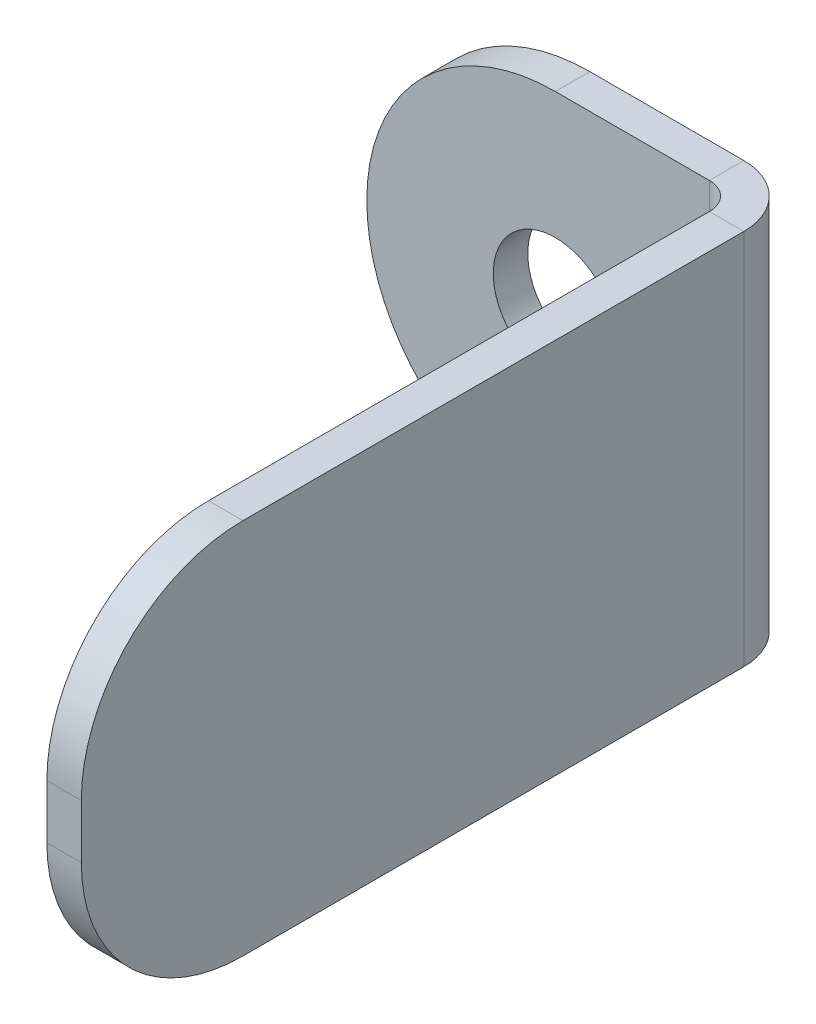
ISO-10303-21;
HEADER;
FILE_DESCRIPTION(('STEP AP214'),'2;1');
FILE_NAME('part.step','',(''),(''),'','','');
FILE_SCHEMA(('AUTOMOTIVE_DESIGN { 1 0 10303 214 1 1 1 1 }'));
ENDSEC;
DATA;
#1=APPLICATION_CONTEXT('core data for automotive mechanical design processes');
#2=APPLICATION_PROTOCOL_DEFINITION('international standard','automotive_design',2000,#1);
#3=PRODUCT_CONTEXT('',#1,'mechanical');
#4=PRODUCT('Part','Part','',(#3));
#5=PRODUCT_RELATED_PRODUCT_CATEGORY('part','',(#4));
#6=PRODUCT_DEFINITION_FORMATION('','',#4);
#7=PRODUCT_DEFINITION_CONTEXT('part definition',#1,'design');
#8=PRODUCT_DEFINITION('design','',#6,#7);
#9=PRODUCT_DEFINITION_SHAPE('','',#8);
#10=(LENGTH_UNIT() NAMED_UNIT(*) SI_UNIT(.MILLI.,.METRE.));
#11=(NAMED_UNIT(*) PLANE_ANGLE_UNIT() SI_UNIT($,.RADIAN.));
#12=(NAMED_UNIT(*) SI_UNIT($,.STERADIAN.) SOLID_ANGLE_UNIT());
#13=UNCERTAINTY_MEASURE_WITH_UNIT(LENGTH_MEASURE(1.E-05),#10,'distance_accuracy_value','');
#14=(GEOMETRIC_REPRESENTATION_CONTEXT(3) GLOBAL_UNCERTAINTY_ASSIGNED_CONTEXT((#13)) GLOBAL_UNIT_ASSIGNED_CONTEXT((#10,
#11,#12)) REPRESENTATION_CONTEXT('',''));
#15=CARTESIAN_POINT('',(0.,0.,0.));
#16=DIRECTION('',(0.,0.,1.));
#17=DIRECTION('',(1.,0.,0.));
#18=AXIS2_PLACEMENT_3D('',#15,#16,#17);
#19=CARTESIAN_POINT('',(-12.7,60.325,1.016));
#20=DIRECTION('',(0.,0.,1.));
#21=DIRECTION('',(1.,0.,0.));
#22=AXIS2_PLACEMENT_3D('',#19,#20,#21);
#23=PLANE('',#22);
#24=CARTESIAN_POINT('',(-12.7,60.325,1.016));
#25=DIRECTION('',(0.,0.,1.));
#26=DIRECTION('',(1.,0.,0.));
#27=AXIS2_PLACEMENT_3D('',#24,#25,#26);
#28=CIRCLE('',#27,1.8288);
#29=CARTESIAN_POINT('',(-10.8712,60.325,1.016));
#30=VERTEX_POINT('',#29);
#31=EDGE_CURVE('E200',#30,#30,#28,.T.);
#32=ORIENTED_EDGE('',*,*,#31,.F.);
#33=EDGE_LOOP('',(#32));
#34=FACE_BOUND('',#33,.T.);
#35=DIRECTION('',(1.,0.,0.));
#36=VECTOR('',#35,1.);
#37=CARTESIAN_POINT('',(-6.35,54.76875,1.016));
#38=LINE('',#37,#36);
#39=CARTESIAN_POINT('',(-12.7,54.76875,1.016));
#40=VERTEX_POINT('',#39);
#41=CARTESIAN_POINT('',(-8.15975,54.76875,1.016));
#42=VERTEX_POINT('',#41);
#43=EDGE_CURVE('E209',#40,#42,#38,.T.);
#44=ORIENTED_EDGE('',*,*,#43,.T.);
#45=DIRECTION('',(0.,1.,0.));
#46=VECTOR('',#45,1.);
#47=CARTESIAN_POINT('',(-8.15975,65.88125,1.016));
#48=LINE('',#47,#46);
#49=CARTESIAN_POINT('',(-8.15975,65.88125,1.016));
#50=VERTEX_POINT('',#49);
#51=EDGE_CURVE('E190',#50,#42,#48,.F.);
#52=ORIENTED_EDGE('',*,*,#51,.F.);
#53=DIRECTION('',(-1.,0.,0.));
#54=VECTOR('',#53,1.);
#55=CARTESIAN_POINT('',(-12.7,65.88125,1.016));
#56=LINE('',#55,#54);
#57=CARTESIAN_POINT('',(-12.7,65.88125,1.016));
#58=VERTEX_POINT('',#57);
#59=EDGE_CURVE('E213',#50,#58,#56,.T.);
#60=ORIENTED_EDGE('',*,*,#59,.T.);
#61=CARTESIAN_POINT('',(-12.7,60.325,1.016));
#62=DIRECTION('',(0.,0.,1.));
#63=DIRECTION('',(1.,0.,0.));
#64=AXIS2_PLACEMENT_3D('',#61,#62,#63);
#65=CIRCLE('',#64,5.55625);
#66=EDGE_CURVE('E206',#58,#40,#65,.T.);
#67=ORIENTED_EDGE('',*,*,#66,.T.);
#68=EDGE_LOOP('',(#44,#52,#60,#67));
#69=FACE_BOUND('',#68,.T.);
#70=ADVANCED_FACE('F60',(#34,#69),#23,.T.);
#71=CARTESIAN_POINT('',(-12.7,60.325,0.));
#72=DIRECTION('',(0.,0.,1.));
#73=DIRECTION('',(1.,0.,0.));
#74=AXIS2_PLACEMENT_3D('',#71,#72,#73);
#75=PLANE('',#74);
#76=CARTESIAN_POINT('',(-12.7,60.325,0.));
#77=DIRECTION('',(0.,0.,1.));
#78=DIRECTION('',(1.,0.,0.));
#79=AXIS2_PLACEMENT_3D('',#76,#77,#78);
#80=CIRCLE('',#79,1.8288);
#81=CARTESIAN_POINT('',(-10.8712,60.325,0.));
#82=VERTEX_POINT('',#81);
#83=EDGE_CURVE('E197',#82,#82,#80,.T.);
#84=ORIENTED_EDGE('',*,*,#83,.T.);
#85=EDGE_LOOP('',(#84));
#86=FACE_BOUND('',#85,.T.);
#87=DIRECTION('',(0.,1.,0.));
#88=VECTOR('',#87,1.);
#89=CARTESIAN_POINT('',(-8.15975,65.88125,0.));
#90=LINE('',#89,#88);
#91=CARTESIAN_POINT('',(-8.15975,65.88125,0.));
#92=VERTEX_POINT('',#91);
#93=CARTESIAN_POINT('',(-8.15975,54.76875,0.));
#94=VERTEX_POINT('',#93);
#95=EDGE_CURVE('E147',#92,#94,#90,.F.);
#96=ORIENTED_EDGE('',*,*,#95,.T.);
#97=DIRECTION('',(1.,0.,0.));
#98=VECTOR('',#97,1.);
#99=CARTESIAN_POINT('',(-6.35,54.76875,0.));
#100=LINE('',#99,#98);
#101=CARTESIAN_POINT('',(-12.7,54.76875,0.));
#102=VERTEX_POINT('',#101);
#103=EDGE_CURVE('E218',#102,#94,#100,.T.);
#104=ORIENTED_EDGE('',*,*,#103,.F.);
#105=CARTESIAN_POINT('',(-12.7,60.325,0.));
#106=DIRECTION('',(0.,0.,1.));
#107=DIRECTION('',(1.,0.,0.));
#108=AXIS2_PLACEMENT_3D('',#105,#106,#107);
#109=CIRCLE('',#108,5.55625);
#110=CARTESIAN_POINT('',(-12.7,65.88125,0.));
#111=VERTEX_POINT('',#110);
#112=EDGE_CURVE('E203',#111,#102,#109,.T.);
#113=ORIENTED_EDGE('',*,*,#112,.F.);
#114=DIRECTION('',(-1.,0.,0.));
#115=VECTOR('',#114,1.);
#116=CARTESIAN_POINT('',(-12.7,65.88125,0.));
#117=LINE('',#116,#115);
#118=EDGE_CURVE('E210',#92,#111,#117,.T.);
#119=ORIENTED_EDGE('',*,*,#118,.F.);
#120=EDGE_LOOP('',(#96,#104,#113,#119));
#121=FACE_BOUND('',#120,.T.);
#122=ADVANCED_FACE('F270',(#86,#121),#75,.F.);
#123=CARTESIAN_POINT('',(-6.35,54.76875,1.016));
#124=DIRECTION('',(0.,1.,0.));
#125=DIRECTION('',(0.,0.,1.));
#126=AXIS2_PLACEMENT_3D('',#123,#124,#125);
#127=PLANE('',#126);
#128=DIRECTION('',(0.,0.,-1.));
#129=VECTOR('',#128,1.);
#130=CARTESIAN_POINT('',(-8.15975,54.76875,1.016));
#131=LINE('',#130,#129);
#132=EDGE_CURVE('E194',#42,#94,#131,.T.);
#133=ORIENTED_EDGE('',*,*,#132,.F.);
#134=ORIENTED_EDGE('',*,*,#43,.F.);
#135=DIRECTION('',(0.,0.,-1.));
#136=VECTOR('',#135,1.);
#137=CARTESIAN_POINT('',(-12.7,54.76875,1.016));
#138=LINE('',#137,#136);
#139=EDGE_CURVE('E224',#40,#102,#138,.T.);
#140=ORIENTED_EDGE('',*,*,#139,.T.);
#141=ORIENTED_EDGE('',*,*,#103,.T.);
#142=EDGE_LOOP('',(#133,#134,#140,#141));
#143=FACE_BOUND('',#142,.T.);
#144=ADVANCED_FACE('F261',(#143),#127,.F.);
#145=CARTESIAN_POINT('',(-12.7,65.88125,1.016));
#146=DIRECTION('',(0.,-1.,0.));
#147=DIRECTION('',(0.,0.,-1.));
#148=AXIS2_PLACEMENT_3D('',#145,#146,#147);
#149=PLANE('',#148);
#150=DIRECTION('',(0.,0.,-1.));
#151=VECTOR('',#150,1.);
#152=CARTESIAN_POINT('',(-8.15975,65.88125,1.016));
#153=LINE('',#152,#151);
#154=EDGE_CURVE('E186',#50,#92,#153,.T.);
#155=ORIENTED_EDGE('',*,*,#154,.T.);
#156=ORIENTED_EDGE('',*,*,#118,.T.);
#157=DIRECTION('',(0.,0.,-1.));
#158=VECTOR('',#157,1.);
#159=CARTESIAN_POINT('',(-12.7,65.88125,1.016));
#160=LINE('',#159,#158);
#161=EDGE_CURVE('E215',#58,#111,#160,.T.);
#162=ORIENTED_EDGE('',*,*,#161,.F.);
#163=ORIENTED_EDGE('',*,*,#59,.F.);
#164=EDGE_LOOP('',(#155,#156,#162,#163));
#165=FACE_BOUND('',#164,.T.);
#166=ADVANCED_FACE('F272',(#165),#149,.F.);
#167=CARTESIAN_POINT('',(-12.7,60.325,1.016));
#168=DIRECTION('',(0.,0.,-1.));
#169=DIRECTION('',(-1.,0.,0.));
#170=AXIS2_PLACEMENT_3D('',#167,#168,#169);
#171=CYLINDRICAL_SURFACE('',#170,5.55625);
#172=ORIENTED_EDGE('',*,*,#112,.T.);
#173=ORIENTED_EDGE('',*,*,#139,.F.);
#174=ORIENTED_EDGE('',*,*,#66,.F.);
#175=ORIENTED_EDGE('',*,*,#161,.T.);
#176=EDGE_LOOP('',(#172,#173,#174,#175));
#177=FACE_BOUND('',#176,.T.);
#178=ADVANCED_FACE('F267',(#177),#171,.T.);
#179=CARTESIAN_POINT('',(-12.7,60.325,1.016));
#180=DIRECTION('',(0.,0.,-1.));
#181=DIRECTION('',(-1.,0.,0.));
#182=AXIS2_PLACEMENT_3D('',#179,#180,#181);
#183=CYLINDRICAL_SURFACE('',#182,1.8288);
#184=ORIENTED_EDGE('',*,*,#31,.T.);
#185=EDGE_LOOP('',(#184));
#186=FACE_BOUND('',#185,.T.);
#187=ORIENTED_EDGE('',*,*,#83,.F.);
#188=EDGE_LOOP('',(#187));
#189=FACE_BOUND('',#188,.T.);
#190=ADVANCED_FACE('F279',(#186,#189),#183,.F.);
#191=CARTESIAN_POINT('',(-8.15975,54.76875,1.80975));
#192=DIRECTION('',(0.,-1.,0.));
#193=DIRECTION('',(0.,0.,-1.));
#194=AXIS2_PLACEMENT_3D('',#191,#192,#193);
#195=PLANE('',#194);
#196=DIRECTION('',(-1.,0.,0.));
#197=VECTOR('',#196,1.);
#198=CARTESIAN_POINT('',(-6.35,54.76875,1.80974999999999));
#199=LINE('',#198,#197);
#200=CARTESIAN_POINT('',(-7.366,54.76875,1.80975));
#201=VERTEX_POINT('',#200);
#202=CARTESIAN_POINT('',(-6.35,54.76875,1.80974999999999));
#203=VERTEX_POINT('',#202);
#204=EDGE_CURVE('E181',#201,#203,#199,.F.);
#205=ORIENTED_EDGE('',*,*,#204,.F.);
#206=CARTESIAN_POINT('',(-8.15975,54.76875,1.80975));
#207=DIRECTION('',(0.,1.,0.));
#208=DIRECTION('',(0.,0.,1.));
#209=AXIS2_PLACEMENT_3D('',#206,#207,#208);
#210=CIRCLE('',#209,0.793750000000002);
#211=EDGE_CURVE('E150',#42,#201,#210,.F.);
#212=ORIENTED_EDGE('',*,*,#211,.F.);
#213=ORIENTED_EDGE('',*,*,#132,.T.);
#214=CARTESIAN_POINT('',(-8.15975,54.76875,1.80975));
#215=DIRECTION('',(0.,1.,0.));
#216=DIRECTION('',(0.,0.,1.));
#217=AXIS2_PLACEMENT_3D('',#214,#215,#216);
#218=CIRCLE('',#217,1.80975);
#219=EDGE_CURVE('E185',#94,#203,#218,.F.);
#220=ORIENTED_EDGE('',*,*,#219,.T.);
#221=EDGE_LOOP('',(#205,#212,#213,#220));
#222=FACE_BOUND('',#221,.T.);
#223=ADVANCED_FACE('F259',(#222),#195,.T.);
#224=CARTESIAN_POINT('',(-8.15975,65.88125,1.80975));
#225=DIRECTION('',(0.,-1.,0.));
#226=DIRECTION('',(0.,0.,-1.));
#227=AXIS2_PLACEMENT_3D('',#224,#225,#226);
#228=PLANE('',#227);
#229=CARTESIAN_POINT('',(-8.15975,65.88125,1.80975));
#230=DIRECTION('',(0.,1.,0.));
#231=DIRECTION('',(0.,0.,1.));
#232=AXIS2_PLACEMENT_3D('',#229,#230,#231);
#233=CIRCLE('',#232,0.793750000000002);
#234=CARTESIAN_POINT('',(-7.366,65.88125,1.80975));
#235=VERTEX_POINT('',#234);
#236=EDGE_CURVE('E157',#235,#50,#233,.T.);
#237=ORIENTED_EDGE('',*,*,#236,.F.);
#238=DIRECTION('',(-1.,0.,0.));
#239=VECTOR('',#238,1.);
#240=CARTESIAN_POINT('',(-7.366,65.88125,1.80975));
#241=LINE('',#240,#239);
#242=CARTESIAN_POINT('',(-6.35,65.88125,1.80974999999999));
#243=VERTEX_POINT('',#242);
#244=EDGE_CURVE('E154',#235,#243,#241,.F.);
#245=ORIENTED_EDGE('',*,*,#244,.T.);
#246=CARTESIAN_POINT('',(-8.15975,65.88125,1.80975));
#247=DIRECTION('',(0.,1.,0.));
#248=DIRECTION('',(0.,0.,1.));
#249=AXIS2_PLACEMENT_3D('',#246,#247,#248);
#250=CIRCLE('',#249,1.80975);
#251=EDGE_CURVE('E140',#243,#92,#250,.T.);
#252=ORIENTED_EDGE('',*,*,#251,.T.);
#253=ORIENTED_EDGE('',*,*,#154,.F.);
#254=EDGE_LOOP('',(#237,#245,#252,#253));
#255=FACE_BOUND('',#254,.T.);
#256=ADVANCED_FACE('F155',(#255),#228,.F.);
#257=CARTESIAN_POINT('',(-8.15975,65.88125,1.80975));
#258=DIRECTION('',(0.,1.,0.));
#259=DIRECTION('',(1.,0.,0.));
#260=AXIS2_PLACEMENT_3D('',#257,#258,#259);
#261=CYLINDRICAL_SURFACE('',#260,1.80975);
#262=ORIENTED_EDGE('',*,*,#95,.F.);
#263=ORIENTED_EDGE('',*,*,#251,.F.);
#264=DIRECTION('',(0.,1.,0.));
#265=VECTOR('',#264,1.);
#266=CARTESIAN_POINT('',(-6.35,54.76875,1.80974999999999));
#267=LINE('',#266,#265);
#268=EDGE_CURVE('E145',#243,#203,#267,.F.);
#269=ORIENTED_EDGE('',*,*,#268,.T.);
#270=ORIENTED_EDGE('',*,*,#219,.F.);
#271=EDGE_LOOP('',(#262,#263,#269,#270));
#272=FACE_BOUND('',#271,.T.);
#273=ADVANCED_FACE('F142',(#272),#261,.T.);
#274=CARTESIAN_POINT('',(-8.15975,65.88125,1.80975));
#275=DIRECTION('',(0.,1.,0.));
#276=DIRECTION('',(1.,0.,0.));
#277=AXIS2_PLACEMENT_3D('',#274,#275,#276);
#278=CYLINDRICAL_SURFACE('',#277,0.793750000000002);
#279=ORIENTED_EDGE('',*,*,#51,.T.);
#280=ORIENTED_EDGE('',*,*,#211,.T.);
#281=DIRECTION('',(0.,1.,0.));
#282=VECTOR('',#281,1.);
#283=CARTESIAN_POINT('',(-7.366,54.76875,1.80975));
#284=LINE('',#283,#282);
#285=EDGE_CURVE('E159',#201,#235,#284,.T.);
#286=ORIENTED_EDGE('',*,*,#285,.T.);
#287=ORIENTED_EDGE('',*,*,#236,.T.);
#288=EDGE_LOOP('',(#279,#280,#286,#287));
#289=FACE_BOUND('',#288,.T.);
#290=ADVANCED_FACE('F255',(#289),#278,.F.);
#291=CARTESIAN_POINT('',(-6.35,54.76875,1.016));
#292=DIRECTION('',(0.,1.,0.));
#293=DIRECTION('',(-1.,0.,0.));
#294=AXIS2_PLACEMENT_3D('',#291,#292,#293);
#295=PLANE('',#294);
#296=DIRECTION('',(0.,0.,-1.));
#297=VECTOR('',#296,1.);
#298=CARTESIAN_POINT('',(-6.35,54.76875,0.));
#299=LINE('',#298,#297);
#300=CARTESIAN_POINT('',(-6.34999999999995,54.76875,16.5735));
#301=VERTEX_POINT('',#300);
#302=EDGE_CURVE('E166',#301,#203,#299,.T.);
#303=ORIENTED_EDGE('',*,*,#302,.F.);
#304=DIRECTION('',(-1.,0.,0.));
#305=VECTOR('',#304,1.);
#306=CARTESIAN_POINT('',(-6.34999999999995,54.76875,16.5735));
#307=LINE('',#306,#305);
#308=CARTESIAN_POINT('',(-7.36599999999995,54.76875,16.5735));
#309=VERTEX_POINT('',#308);
#310=EDGE_CURVE('E227',#301,#309,#307,.T.);
#311=ORIENTED_EDGE('',*,*,#310,.T.);
#312=DIRECTION('',(0.,0.,1.));
#313=VECTOR('',#312,1.);
#314=CARTESIAN_POINT('',(-7.366,54.76875,1.016));
#315=LINE('',#314,#313);
#316=EDGE_CURVE('E167',#309,#201,#315,.F.);
#317=ORIENTED_EDGE('',*,*,#316,.T.);
#318=ORIENTED_EDGE('',*,*,#204,.T.);
#319=EDGE_LOOP('',(#303,#311,#317,#318));
#320=FACE_BOUND('',#319,.T.);
#321=ADVANCED_FACE('F243',(#320),#295,.F.);
#322=CARTESIAN_POINT('',(-6.34999999999993,65.88125,21.336));
#323=DIRECTION('',(0.,-1.,0.));
#324=DIRECTION('',(1.,0.,0.));
#325=AXIS2_PLACEMENT_3D('',#322,#323,#324);
#326=PLANE('',#325);
#327=DIRECTION('',(0.,0.,-1.));
#328=VECTOR('',#327,1.);
#329=CARTESIAN_POINT('',(-7.36599999999993,65.88125,21.336));
#330=LINE('',#329,#328);
#331=CARTESIAN_POINT('',(-7.36599999999995,65.88125,16.5735));
#332=VERTEX_POINT('',#331);
#333=EDGE_CURVE('E177',#235,#332,#330,.F.);
#334=ORIENTED_EDGE('',*,*,#333,.T.);
#335=DIRECTION('',(-1.,0.,0.));
#336=VECTOR('',#335,1.);
#337=CARTESIAN_POINT('',(-6.34999999999995,65.88125,16.5735));
#338=LINE('',#337,#336);
#339=CARTESIAN_POINT('',(-6.34999999999995,65.88125,16.5735));
#340=VERTEX_POINT('',#339);
#341=EDGE_CURVE('E13',#332,#340,#338,.F.);
#342=ORIENTED_EDGE('',*,*,#341,.T.);
#343=DIRECTION('',(0.,0.,1.));
#344=VECTOR('',#343,1.);
#345=CARTESIAN_POINT('',(-6.35000000000001,65.88125,0.));
#346=LINE('',#345,#344);
#347=EDGE_CURVE('E163',#243,#340,#346,.T.);
#348=ORIENTED_EDGE('',*,*,#347,.F.);
#349=ORIENTED_EDGE('',*,*,#244,.F.);
#350=EDGE_LOOP('',(#334,#342,#348,#349));
#351=FACE_BOUND('',#350,.T.);
#352=ADVANCED_FACE('F169',(#351),#326,.F.);
#353=CARTESIAN_POINT('',(-6.35,0.,0.));
#354=DIRECTION('',(-1.,0.,0.));
#355=DIRECTION('',(0.,0.,1.));
#356=AXIS2_PLACEMENT_3D('',#353,#354,#355);
#357=PLANE('',#356);
#358=DIRECTION('',(0.,-1.,0.));
#359=VECTOR('',#358,1.);
#360=CARTESIAN_POINT('',(-6.34999999999992,0.,21.336));
#361=LINE('',#360,#359);
#362=CARTESIAN_POINT('',(-6.34999999999993,61.11875,21.336));
#363=VERTEX_POINT('',#362);
#364=CARTESIAN_POINT('',(-6.34999999999993,59.53125,21.336));
#365=VERTEX_POINT('',#364);
#366=EDGE_CURVE('E170',#363,#365,#361,.T.);
#367=ORIENTED_EDGE('',*,*,#366,.T.);
#368=CARTESIAN_POINT('',(-6.34999999999995,59.53125,16.5735));
#369=DIRECTION('',(-1.,0.,0.));
#370=DIRECTION('',(0.,0.,1.));
#371=AXIS2_PLACEMENT_3D('',#368,#369,#370);
#372=CIRCLE('',#371,4.7625);
#373=EDGE_CURVE('E68',#365,#301,#372,.F.);
#374=ORIENTED_EDGE('',*,*,#373,.T.);
#375=ORIENTED_EDGE('',*,*,#302,.T.);
#376=ORIENTED_EDGE('',*,*,#268,.F.);
#377=ORIENTED_EDGE('',*,*,#347,.T.);
#378=CARTESIAN_POINT('',(-6.34999999999995,61.11875,16.5735));
#379=DIRECTION('',(-1.,0.,0.));
#380=DIRECTION('',(0.,0.,1.));
#381=AXIS2_PLACEMENT_3D('',#378,#379,#380);
#382=CIRCLE('',#381,4.7625);
#383=EDGE_CURVE('E238',#340,#363,#382,.F.);
#384=ORIENTED_EDGE('',*,*,#383,.T.);
#385=EDGE_LOOP('',(#367,#374,#375,#376,#377,#384));
#386=FACE_BOUND('',#385,.T.);
#387=ADVANCED_FACE('F162',(#386),#357,.F.);
#388=CARTESIAN_POINT('',(-7.366,0.,0.));
#389=DIRECTION('',(-1.,0.,0.));
#390=DIRECTION('',(0.,0.,1.));
#391=AXIS2_PLACEMENT_3D('',#388,#389,#390);
#392=PLANE('',#391);
#393=ORIENTED_EDGE('',*,*,#316,.F.);
#394=CARTESIAN_POINT('',(-7.36599999999995,59.53125,16.5735));
#395=DIRECTION('',(-1.,0.,0.));
#396=DIRECTION('',(0.,0.,1.));
#397=AXIS2_PLACEMENT_3D('',#394,#395,#396);
#398=CIRCLE('',#397,4.7625);
#399=CARTESIAN_POINT('',(-7.36599999999993,59.53125,21.336));
#400=VERTEX_POINT('',#399);
#401=EDGE_CURVE('E232',#309,#400,#398,.T.);
#402=ORIENTED_EDGE('',*,*,#401,.T.);
#403=DIRECTION('',(0.,1.,0.));
#404=VECTOR('',#403,1.);
#405=CARTESIAN_POINT('',(-7.36599999999993,54.76875,21.336));
#406=LINE('',#405,#404);
#407=CARTESIAN_POINT('',(-7.36599999999993,61.11875,21.336));
#408=VERTEX_POINT('',#407);
#409=EDGE_CURVE('E173',#408,#400,#406,.F.);
#410=ORIENTED_EDGE('',*,*,#409,.F.);
#411=CARTESIAN_POINT('',(-7.36599999999995,61.11875,16.5735));
#412=DIRECTION('',(-1.,0.,0.));
#413=DIRECTION('',(0.,0.,1.));
#414=AXIS2_PLACEMENT_3D('',#411,#412,#413);
#415=CIRCLE('',#414,4.7625);
#416=EDGE_CURVE('E230',#408,#332,#415,.T.);
#417=ORIENTED_EDGE('',*,*,#416,.T.);
#418=ORIENTED_EDGE('',*,*,#333,.F.);
#419=ORIENTED_EDGE('',*,*,#285,.F.);
#420=EDGE_LOOP('',(#393,#402,#410,#417,#418,#419));
#421=FACE_BOUND('',#420,.T.);
#422=ADVANCED_FACE('F249',(#421),#392,.T.);
#423=CARTESIAN_POINT('',(-6.34999999999993,54.76875,21.336));
#424=DIRECTION('',(0.,0.,-1.));
#425=DIRECTION('',(-1.,0.,0.));
#426=AXIS2_PLACEMENT_3D('',#423,#424,#425);
#427=PLANE('',#426);
#428=ORIENTED_EDGE('',*,*,#409,.T.);
#429=DIRECTION('',(-1.,0.,0.));
#430=VECTOR('',#429,1.);
#431=CARTESIAN_POINT('',(-6.34999999999993,59.53125,21.336));
#432=LINE('',#431,#430);
#433=EDGE_CURVE('E81',#400,#365,#432,.F.);
#434=ORIENTED_EDGE('',*,*,#433,.T.);
#435=ORIENTED_EDGE('',*,*,#366,.F.);
#436=DIRECTION('',(-1.,0.,0.));
#437=VECTOR('',#436,1.);
#438=CARTESIAN_POINT('',(-6.34999999999993,61.11875,21.336));
#439=LINE('',#438,#437);
#440=EDGE_CURVE('E234',#363,#408,#439,.T.);
#441=ORIENTED_EDGE('',*,*,#440,.T.);
#442=EDGE_LOOP('',(#428,#434,#435,#441));
#443=FACE_BOUND('',#442,.T.);
#444=ADVANCED_FACE('F251',(#443),#427,.F.);
#445=CARTESIAN_POINT('',(-6.34999999999995,59.53125,16.5735));
#446=DIRECTION('',(-1.,0.,0.));
#447=DIRECTION('',(0.,0.,1.));
#448=AXIS2_PLACEMENT_3D('',#445,#446,#447);
#449=CYLINDRICAL_SURFACE('',#448,4.7625);
#450=ORIENTED_EDGE('',*,*,#373,.F.);
#451=ORIENTED_EDGE('',*,*,#433,.F.);
#452=ORIENTED_EDGE('',*,*,#401,.F.);
#453=ORIENTED_EDGE('',*,*,#310,.F.);
#454=EDGE_LOOP('',(#450,#451,#452,#453));
#455=FACE_BOUND('',#454,.T.);
#456=ADVANCED_FACE('F246',(#455),#449,.T.);
#457=CARTESIAN_POINT('',(-6.34999999999995,61.11875,16.5735));
#458=DIRECTION('',(-1.,0.,0.));
#459=DIRECTION('',(0.,0.,1.));
#460=AXIS2_PLACEMENT_3D('',#457,#458,#459);
#461=CYLINDRICAL_SURFACE('',#460,4.7625);
#462=ORIENTED_EDGE('',*,*,#383,.F.);
#463=ORIENTED_EDGE('',*,*,#341,.F.);
#464=ORIENTED_EDGE('',*,*,#416,.F.);
#465=ORIENTED_EDGE('',*,*,#440,.F.);
#466=EDGE_LOOP('',(#462,#463,#464,#465));
#467=FACE_BOUND('',#466,.T.);
#468=ADVANCED_FACE('F62',(#467),#461,.T.);
#469=CLOSED_SHELL('',(#70,#122,#144,#166,#178,#190,#223,#256,#273,#290,#321,#352,#387,#422,#444,
#456,#468));
#470=MANIFOLD_SOLID_BREP('B2',#469);
#471=ADVANCED_BREP_SHAPE_REPRESENTATION('',(#18,#470),#14);
#472=SHAPE_DEFINITION_REPRESENTATION(#9,#471);
ENDSEC;
END-ISO-10303-21;
